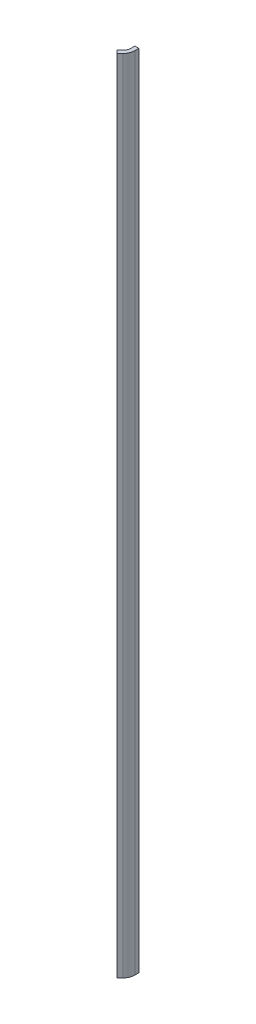
ISO-10303-21;
HEADER;
FILE_DESCRIPTION(('STEP AP214'),'2;1');
FILE_NAME('part.step','',(''),(''),'','','');
FILE_SCHEMA(('AUTOMOTIVE_DESIGN { 1 0 10303 214 1 1 1 1 }'));
ENDSEC;
DATA;
#1=APPLICATION_CONTEXT('core data for automotive mechanical design processes');
#2=APPLICATION_PROTOCOL_DEFINITION('international standard','automotive_design',2000,#1);
#3=PRODUCT_CONTEXT('',#1,'mechanical');
#4=PRODUCT('Part','Part','',(#3));
#5=PRODUCT_RELATED_PRODUCT_CATEGORY('part','',(#4));
#6=PRODUCT_DEFINITION_FORMATION('','',#4);
#7=PRODUCT_DEFINITION_CONTEXT('part definition',#1,'design');
#8=PRODUCT_DEFINITION('design','',#6,#7);
#9=PRODUCT_DEFINITION_SHAPE('','',#8);
#10=(LENGTH_UNIT() NAMED_UNIT(*) SI_UNIT(.MILLI.,.METRE.));
#11=(NAMED_UNIT(*) PLANE_ANGLE_UNIT() SI_UNIT($,.RADIAN.));
#12=(NAMED_UNIT(*) SI_UNIT($,.STERADIAN.) SOLID_ANGLE_UNIT());
#13=UNCERTAINTY_MEASURE_WITH_UNIT(LENGTH_MEASURE(1.E-05),#10,'distance_accuracy_value','');
#14=(GEOMETRIC_REPRESENTATION_CONTEXT(3) GLOBAL_UNCERTAINTY_ASSIGNED_CONTEXT((#13)) GLOBAL_UNIT_ASSIGNED_CONTEXT((#10,
#11,#12)) REPRESENTATION_CONTEXT('',''));
#15=CARTESIAN_POINT('',(0.,0.,0.));
#16=DIRECTION('',(0.,0.,1.));
#17=DIRECTION('',(1.,0.,0.));
#18=AXIS2_PLACEMENT_3D('',#15,#16,#17);
#19=CARTESIAN_POINT('',(64.,400.,33.9019376043759));
#20=DIRECTION('',(1.,0.,0.));
#21=DIRECTION('',(0.,0.,-1.));
#22=AXIS2_PLACEMENT_3D('',#19,#20,#21);
#23=PLANE('',#22);
#24=DIRECTION('',(0.,0.,1.));
#25=VECTOR('',#24,1.);
#26=CARTESIAN_POINT('',(64.,0.,33.9019376043759));
#27=LINE('',#26,#25);
#28=CARTESIAN_POINT('',(64.,0.,33.9019376043759));
#29=VERTEX_POINT('',#28);
#30=CARTESIAN_POINT('',(64.,0.,35.9019376043759));
#31=VERTEX_POINT('',#30);
#32=EDGE_CURVE('E139',#29,#31,#27,.T.);
#33=ORIENTED_EDGE('',*,*,#32,.T.);
#34=DIRECTION('',(0.,-1.,0.));
#35=VECTOR('',#34,1.);
#36=CARTESIAN_POINT('',(64.,400.,35.9019376043759));
#37=LINE('',#36,#35);
#38=CARTESIAN_POINT('',(64.,400.,35.9019376043759));
#39=VERTEX_POINT('',#38);
#40=EDGE_CURVE('E11',#39,#31,#37,.T.);
#41=ORIENTED_EDGE('',*,*,#40,.F.);
#42=DIRECTION('',(0.,0.,1.));
#43=VECTOR('',#42,1.);
#44=CARTESIAN_POINT('',(64.,400.,33.9019376043759));
#45=LINE('',#44,#43);
#46=CARTESIAN_POINT('',(64.,400.,33.9019376043759));
#47=VERTEX_POINT('',#46);
#48=EDGE_CURVE('E93',#47,#39,#45,.T.);
#49=ORIENTED_EDGE('',*,*,#48,.F.);
#50=DIRECTION('',(0.,-1.,0.));
#51=VECTOR('',#50,1.);
#52=CARTESIAN_POINT('',(64.,400.,33.9019376043759));
#53=LINE('',#52,#51);
#54=EDGE_CURVE('E56',#47,#29,#53,.T.);
#55=ORIENTED_EDGE('',*,*,#54,.T.);
#56=EDGE_LOOP('',(#33,#41,#49,#55));
#57=FACE_BOUND('',#56,.T.);
#58=ADVANCED_FACE('F39',(#57),#23,.F.);
#59=CARTESIAN_POINT('',(60.,400.,35.9019376043759));
#60=DIRECTION('',(0.,-1.,0.));
#61=DIRECTION('',(0.,0.,-1.));
#62=AXIS2_PLACEMENT_3D('',#59,#60,#61);
#63=CYLINDRICAL_SURFACE('',#62,4.00000000000001);
#64=CARTESIAN_POINT('',(60.,0.,35.9019376043759));
#65=DIRECTION('',(0.,1.,0.));
#66=DIRECTION('',(0.,0.,1.));
#67=AXIS2_PLACEMENT_3D('',#64,#65,#66);
#68=CIRCLE('',#67,4.00000000000001);
#69=CARTESIAN_POINT('',(62.8284271247462,0.,38.7303647291221));
#70=VERTEX_POINT('',#69);
#71=EDGE_CURVE('E142',#70,#31,#68,.T.);
#72=ORIENTED_EDGE('',*,*,#71,.F.);
#73=DIRECTION('',(0.,-1.,0.));
#74=VECTOR('',#73,1.);
#75=CARTESIAN_POINT('',(62.8284271247462,400.,38.7303647291221));
#76=LINE('',#75,#74);
#77=CARTESIAN_POINT('',(62.8284271247462,400.,38.7303647291221));
#78=VERTEX_POINT('',#77);
#79=EDGE_CURVE('E48',#78,#70,#76,.T.);
#80=ORIENTED_EDGE('',*,*,#79,.F.);
#81=CARTESIAN_POINT('',(60.,400.,35.9019376043759));
#82=DIRECTION('',(0.,1.,0.));
#83=DIRECTION('',(0.,0.,1.));
#84=AXIS2_PLACEMENT_3D('',#81,#82,#83);
#85=CIRCLE('',#84,4.00000000000001);
#86=EDGE_CURVE('E205',#78,#39,#85,.T.);
#87=ORIENTED_EDGE('',*,*,#86,.T.);
#88=ORIENTED_EDGE('',*,*,#40,.T.);
#89=EDGE_LOOP('',(#72,#80,#87,#88));
#90=FACE_BOUND('',#89,.T.);
#91=ADVANCED_FACE('F187',(#90),#63,.F.);
#92=CARTESIAN_POINT('',(61.4142135623731,400.,40.1445782914952));
#93=DIRECTION('',(-0.707106781186546,0.,-0.707106781186549));
#94=DIRECTION('',(-0.707106781186549,0.,0.707106781186546));
#95=AXIS2_PLACEMENT_3D('',#92,#93,#94);
#96=PLANE('',#95);
#97=DIRECTION('',(0.707106781186549,0.,-0.707106781186546));
#98=VECTOR('',#97,1.);
#99=CARTESIAN_POINT('',(61.4142135623731,0.,40.1445782914952));
#100=LINE('',#99,#98);
#101=CARTESIAN_POINT('',(61.4142135623731,0.,40.1445782914952));
#102=VERTEX_POINT('',#101);
#103=EDGE_CURVE('E146',#102,#70,#100,.T.);
#104=ORIENTED_EDGE('',*,*,#103,.F.);
#105=DIRECTION('',(0.,-1.,0.));
#106=VECTOR('',#105,1.);
#107=CARTESIAN_POINT('',(61.4142135623731,400.,40.1445782914952));
#108=LINE('',#107,#106);
#109=CARTESIAN_POINT('',(61.4142135623731,400.,40.1445782914952));
#110=VERTEX_POINT('',#109);
#111=EDGE_CURVE('E175',#110,#102,#108,.T.);
#112=ORIENTED_EDGE('',*,*,#111,.F.);
#113=DIRECTION('',(0.707106781186549,0.,-0.707106781186546));
#114=VECTOR('',#113,1.);
#115=CARTESIAN_POINT('',(61.4142135623731,400.,40.1445782914952));
#116=LINE('',#115,#114);
#117=EDGE_CURVE('E184',#110,#78,#116,.T.);
#118=ORIENTED_EDGE('',*,*,#117,.T.);
#119=ORIENTED_EDGE('',*,*,#79,.T.);
#120=EDGE_LOOP('',(#104,#112,#118,#119));
#121=FACE_BOUND('',#120,.T.);
#122=ADVANCED_FACE('F182',(#121),#96,.T.);
#123=CARTESIAN_POINT('',(61.4142135623731,400.,40.1445782914952));
#124=DIRECTION('',(0.707106781186548,0.,-0.707106781186548));
#125=DIRECTION('',(-0.707106781186548,0.,-0.707106781186548));
#126=AXIS2_PLACEMENT_3D('',#123,#124,#125);
#127=PLANE('',#126);
#128=DIRECTION('',(0.707106781186548,0.,0.707106781186548));
#129=VECTOR('',#128,1.);
#130=CARTESIAN_POINT('',(61.4142135623731,0.,40.1445782914952));
#131=LINE('',#130,#129);
#132=CARTESIAN_POINT('',(62.8284271247462,0.,41.5587918538683));
#133=VERTEX_POINT('',#132);
#134=EDGE_CURVE('E150',#102,#133,#131,.T.);
#135=ORIENTED_EDGE('',*,*,#134,.T.);
#136=DIRECTION('',(0.,-1.,0.));
#137=VECTOR('',#136,1.);
#138=CARTESIAN_POINT('',(62.8284271247462,400.,41.5587918538683));
#139=LINE('',#138,#137);
#140=CARTESIAN_POINT('',(62.8284271247462,400.,41.5587918538683));
#141=VERTEX_POINT('',#140);
#142=EDGE_CURVE('E171',#141,#133,#139,.T.);
#143=ORIENTED_EDGE('',*,*,#142,.F.);
#144=DIRECTION('',(0.707106781186548,0.,0.707106781186548));
#145=VECTOR('',#144,1.);
#146=CARTESIAN_POINT('',(61.4142135623731,400.,40.1445782914952));
#147=LINE('',#146,#145);
#148=EDGE_CURVE('E199',#110,#141,#147,.T.);
#149=ORIENTED_EDGE('',*,*,#148,.F.);
#150=ORIENTED_EDGE('',*,*,#111,.T.);
#151=EDGE_LOOP('',(#135,#143,#149,#150));
#152=FACE_BOUND('',#151,.T.);
#153=ADVANCED_FACE('F194',(#152),#127,.F.);
#154=CARTESIAN_POINT('',(62.8284271247462,400.,41.5587918538683));
#155=DIRECTION('',(-0.707106781186553,0.,-0.707106781186542));
#156=DIRECTION('',(-0.707106781186542,0.,0.707106781186553));
#157=AXIS2_PLACEMENT_3D('',#154,#155,#156);
#158=PLANE('',#157);
#159=DIRECTION('',(0.707106781186542,0.,-0.707106781186553));
#160=VECTOR('',#159,1.);
#161=CARTESIAN_POINT('',(62.8284271247462,0.,41.5587918538683));
#162=LINE('',#161,#160);
#163=CARTESIAN_POINT('',(64.2426406871193,0.,40.1445782914952));
#164=VERTEX_POINT('',#163);
#165=EDGE_CURVE('E153',#133,#164,#162,.T.);
#166=ORIENTED_EDGE('',*,*,#165,.T.);
#167=DIRECTION('',(0.,-1.,0.));
#168=VECTOR('',#167,1.);
#169=CARTESIAN_POINT('',(64.2426406871193,400.,40.1445782914952));
#170=LINE('',#169,#168);
#171=CARTESIAN_POINT('',(64.2426406871193,400.,40.1445782914952));
#172=VERTEX_POINT('',#171);
#173=EDGE_CURVE('E129',#172,#164,#170,.T.);
#174=ORIENTED_EDGE('',*,*,#173,.F.);
#175=DIRECTION('',(0.707106781186542,0.,-0.707106781186553));
#176=VECTOR('',#175,1.);
#177=CARTESIAN_POINT('',(62.8284271247462,400.,41.5587918538683));
#178=LINE('',#177,#176);
#179=EDGE_CURVE('E115',#141,#172,#178,.T.);
#180=ORIENTED_EDGE('',*,*,#179,.F.);
#181=ORIENTED_EDGE('',*,*,#142,.T.);
#182=EDGE_LOOP('',(#166,#174,#180,#181));
#183=FACE_BOUND('',#182,.T.);
#184=ADVANCED_FACE('F197',(#183),#158,.F.);
#185=CARTESIAN_POINT('',(60.,400.,35.9019376043759));
#186=DIRECTION('',(0.,-1.,0.));
#187=DIRECTION('',(0.,0.,-1.));
#188=AXIS2_PLACEMENT_3D('',#185,#186,#187);
#189=CYLINDRICAL_SURFACE('',#188,6.);
#190=CARTESIAN_POINT('',(60.,0.,35.9019376043759));
#191=DIRECTION('',(0.,1.,0.));
#192=DIRECTION('',(0.,0.,1.));
#193=AXIS2_PLACEMENT_3D('',#190,#191,#192);
#194=CIRCLE('',#193,6.);
#195=CARTESIAN_POINT('',(66.,0.,35.9019376043759));
#196=VERTEX_POINT('',#195);
#197=EDGE_CURVE('E125',#164,#196,#194,.T.);
#198=ORIENTED_EDGE('',*,*,#197,.T.);
#199=DIRECTION('',(0.,-1.,0.));
#200=VECTOR('',#199,1.);
#201=CARTESIAN_POINT('',(66.,400.,35.9019376043759));
#202=LINE('',#201,#200);
#203=CARTESIAN_POINT('',(66.,400.,35.9019376043759));
#204=VERTEX_POINT('',#203);
#205=EDGE_CURVE('E122',#204,#196,#202,.T.);
#206=ORIENTED_EDGE('',*,*,#205,.F.);
#207=CARTESIAN_POINT('',(60.,400.,35.9019376043759));
#208=DIRECTION('',(0.,1.,0.));
#209=DIRECTION('',(0.,0.,1.));
#210=AXIS2_PLACEMENT_3D('',#207,#208,#209);
#211=CIRCLE('',#210,6.);
#212=EDGE_CURVE('E109',#172,#204,#211,.T.);
#213=ORIENTED_EDGE('',*,*,#212,.F.);
#214=ORIENTED_EDGE('',*,*,#173,.T.);
#215=EDGE_LOOP('',(#198,#206,#213,#214));
#216=FACE_BOUND('',#215,.T.);
#217=ADVANCED_FACE('F123',(#216),#189,.T.);
#218=CARTESIAN_POINT('',(66.,400.,33.9019376043759));
#219=DIRECTION('',(1.,0.,0.));
#220=DIRECTION('',(0.,0.,-1.));
#221=AXIS2_PLACEMENT_3D('',#218,#219,#220);
#222=PLANE('',#221);
#223=DIRECTION('',(0.,0.,1.));
#224=VECTOR('',#223,1.);
#225=CARTESIAN_POINT('',(66.,0.,33.9019376043759));
#226=LINE('',#225,#224);
#227=CARTESIAN_POINT('',(66.,0.,33.9019376043759));
#228=VERTEX_POINT('',#227);
#229=EDGE_CURVE('E158',#228,#196,#226,.T.);
#230=ORIENTED_EDGE('',*,*,#229,.F.);
#231=DIRECTION('',(0.,-1.,0.));
#232=VECTOR('',#231,1.);
#233=CARTESIAN_POINT('',(66.,400.,33.9019376043759));
#234=LINE('',#233,#232);
#235=CARTESIAN_POINT('',(66.,400.,33.9019376043759));
#236=VERTEX_POINT('',#235);
#237=EDGE_CURVE('E81',#236,#228,#234,.T.);
#238=ORIENTED_EDGE('',*,*,#237,.F.);
#239=DIRECTION('',(0.,0.,1.));
#240=VECTOR('',#239,1.);
#241=CARTESIAN_POINT('',(66.,400.,33.9019376043759));
#242=LINE('',#241,#240);
#243=EDGE_CURVE('E113',#236,#204,#242,.T.);
#244=ORIENTED_EDGE('',*,*,#243,.T.);
#245=ORIENTED_EDGE('',*,*,#205,.T.);
#246=EDGE_LOOP('',(#230,#238,#244,#245));
#247=FACE_BOUND('',#246,.T.);
#248=ADVANCED_FACE('F131',(#247),#222,.T.);
#249=CARTESIAN_POINT('',(64.,400.,33.9019376043759));
#250=DIRECTION('',(0.,0.,-1.));
#251=DIRECTION('',(-1.,0.,0.));
#252=AXIS2_PLACEMENT_3D('',#249,#250,#251);
#253=PLANE('',#252);
#254=DIRECTION('',(1.,0.,0.));
#255=VECTOR('',#254,1.);
#256=CARTESIAN_POINT('',(64.,0.,33.9019376043759));
#257=LINE('',#256,#255);
#258=EDGE_CURVE('E161',#29,#228,#257,.T.);
#259=ORIENTED_EDGE('',*,*,#258,.F.);
#260=ORIENTED_EDGE('',*,*,#54,.F.);
#261=DIRECTION('',(1.,0.,0.));
#262=VECTOR('',#261,1.);
#263=CARTESIAN_POINT('',(64.,400.,33.9019376043759));
#264=LINE('',#263,#262);
#265=EDGE_CURVE('E133',#47,#236,#264,.T.);
#266=ORIENTED_EDGE('',*,*,#265,.T.);
#267=ORIENTED_EDGE('',*,*,#237,.T.);
#268=EDGE_LOOP('',(#259,#260,#266,#267));
#269=FACE_BOUND('',#268,.T.);
#270=ADVANCED_FACE('F209',(#269),#253,.T.);
#271=CARTESIAN_POINT('',(60.,400.,35.9019376043759));
#272=DIRECTION('',(0.,1.,0.));
#273=DIRECTION('',(0.,0.,1.));
#274=AXIS2_PLACEMENT_3D('',#271,#272,#273);
#275=PLANE('',#274);
#276=ORIENTED_EDGE('',*,*,#48,.T.);
#277=ORIENTED_EDGE('',*,*,#86,.F.);
#278=ORIENTED_EDGE('',*,*,#117,.F.);
#279=ORIENTED_EDGE('',*,*,#148,.T.);
#280=ORIENTED_EDGE('',*,*,#179,.T.);
#281=ORIENTED_EDGE('',*,*,#212,.T.);
#282=ORIENTED_EDGE('',*,*,#243,.F.);
#283=ORIENTED_EDGE('',*,*,#265,.F.);
#284=EDGE_LOOP('',(#276,#277,#278,#279,#280,#281,#282,#283));
#285=FACE_BOUND('',#284,.T.);
#286=ADVANCED_FACE('F111',(#285),#275,.T.);
#287=CARTESIAN_POINT('',(60.,0.,35.9019376043759));
#288=DIRECTION('',(0.,1.,0.));
#289=DIRECTION('',(0.,0.,1.));
#290=AXIS2_PLACEMENT_3D('',#287,#288,#289);
#291=PLANE('',#290);
#292=ORIENTED_EDGE('',*,*,#32,.F.);
#293=ORIENTED_EDGE('',*,*,#258,.T.);
#294=ORIENTED_EDGE('',*,*,#229,.T.);
#295=ORIENTED_EDGE('',*,*,#197,.F.);
#296=ORIENTED_EDGE('',*,*,#165,.F.);
#297=ORIENTED_EDGE('',*,*,#134,.F.);
#298=ORIENTED_EDGE('',*,*,#103,.T.);
#299=ORIENTED_EDGE('',*,*,#71,.T.);
#300=EDGE_LOOP('',(#292,#293,#294,#295,#296,#297,#298,#299));
#301=FACE_BOUND('',#300,.T.);
#302=ADVANCED_FACE('F190',(#301),#291,.F.);
#303=CLOSED_SHELL('',(#58,#91,#122,#153,#184,#217,#248,#270,#286,#302));
#304=MANIFOLD_SOLID_BREP('B2',#303);
#305=ADVANCED_BREP_SHAPE_REPRESENTATION('',(#18,#304),#14);
#306=SHAPE_DEFINITION_REPRESENTATION(#9,#305);
ENDSEC;
END-ISO-10303-21;
